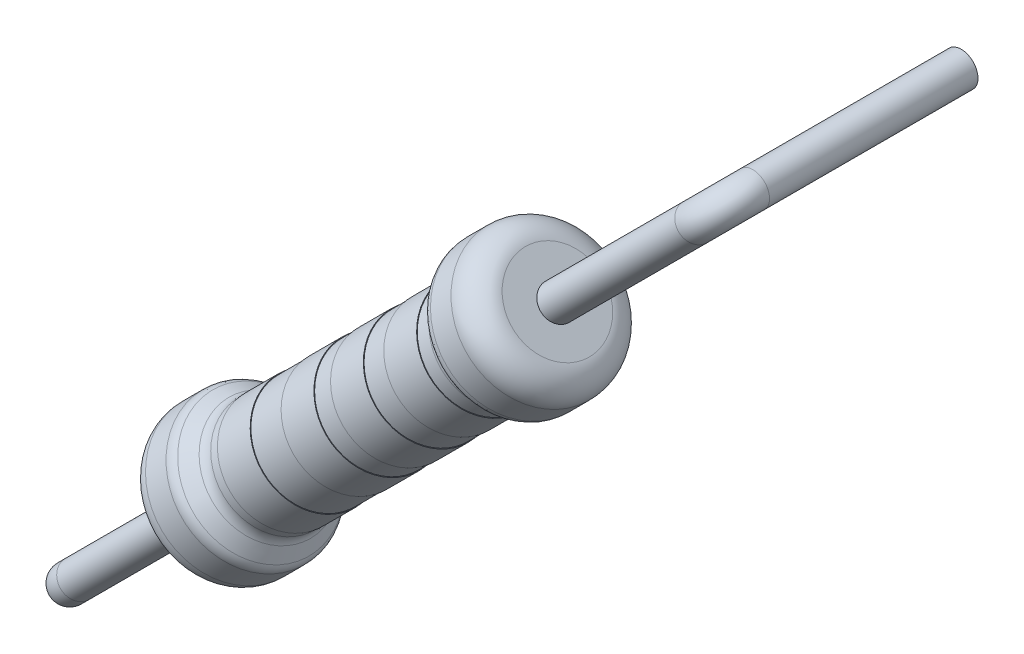
ISO-10303-21;
HEADER;
FILE_DESCRIPTION(('STEP AP214'),'2;1');
FILE_NAME('part.step','',(''),(''),'','','');
FILE_SCHEMA(('AUTOMOTIVE_DESIGN { 1 0 10303 214 1 1 1 1 }'));
ENDSEC;
DATA;
#1=APPLICATION_CONTEXT('core data for automotive mechanical design processes');
#2=APPLICATION_PROTOCOL_DEFINITION('international standard','automotive_design',2000,#1);
#3=PRODUCT_CONTEXT('',#1,'mechanical');
#4=PRODUCT('Part','Part','',(#3));
#5=PRODUCT_RELATED_PRODUCT_CATEGORY('part','',(#4));
#6=PRODUCT_DEFINITION_FORMATION('','',#4);
#7=PRODUCT_DEFINITION_CONTEXT('part definition',#1,'design');
#8=PRODUCT_DEFINITION('design','',#6,#7);
#9=PRODUCT_DEFINITION_SHAPE('','',#8);
#10=(LENGTH_UNIT() NAMED_UNIT(*) SI_UNIT(.MILLI.,.METRE.));
#11=(NAMED_UNIT(*) PLANE_ANGLE_UNIT() SI_UNIT($,.RADIAN.));
#12=(NAMED_UNIT(*) SI_UNIT($,.STERADIAN.) SOLID_ANGLE_UNIT());
#13=UNCERTAINTY_MEASURE_WITH_UNIT(LENGTH_MEASURE(1.E-05),#10,'distance_accuracy_value','');
#14=(GEOMETRIC_REPRESENTATION_CONTEXT(3) GLOBAL_UNCERTAINTY_ASSIGNED_CONTEXT((#13)) GLOBAL_UNIT_ASSIGNED_CONTEXT((#10,
#11,#12)) REPRESENTATION_CONTEXT('',''));
#15=CARTESIAN_POINT('',(0.,0.,0.));
#16=DIRECTION('',(0.,0.,1.));
#17=DIRECTION('',(1.,0.,0.));
#18=AXIS2_PLACEMENT_3D('',#15,#16,#17);
#19=CARTESIAN_POINT('',(9.78091905349187,15.8781031060535,0.7747));
#20=DIRECTION('',(-0.707106781186548,0.707106781186548,0.));
#21=DIRECTION('',(0.,0.,1.));
#22=AXIS2_PLACEMENT_3D('',#19,#20,#21);
#23=TOROIDAL_SURFACE('',#22,0.635,0.3175);
#24=CARTESIAN_POINT('',(9.33190624743841,15.4290903000001,0.7747));
#25=DIRECTION('',(0.,0.,-1.));
#26=DIRECTION('',(-0.707106781186548,-0.707106781186548,0.));
#27=AXIS2_PLACEMENT_3D('',#24,#25,#26);
#28=CIRCLE('',#27,0.3175);
#29=CARTESIAN_POINT('',(9.55641265046514,15.6535967030267,0.7747));
#30=VERTEX_POINT('',#29);
#31=EDGE_CURVE('E40',#30,#30,#28,.T.);
#32=ORIENTED_EDGE('',*,*,#31,.F.);
#33=EDGE_LOOP('',(#32));
#34=FACE_BOUND('',#33,.T.);
#35=CARTESIAN_POINT('',(9.78091905349187,15.8781031060535,1.4097));
#36=DIRECTION('',(-0.707106781186548,-0.707106781186548,0.));
#37=DIRECTION('',(0.,0.,1.));
#38=AXIS2_PLACEMENT_3D('',#35,#36,#37);
#39=CIRCLE('',#38,0.3175);
#40=CARTESIAN_POINT('',(9.78091905349187,15.8781031060535,1.0922));
#41=VERTEX_POINT('',#40);
#42=EDGE_CURVE('E11',#41,#41,#39,.T.);
#43=ORIENTED_EDGE('',*,*,#42,.T.);
#44=EDGE_LOOP('',(#43));
#45=FACE_BOUND('',#44,.T.);
#46=ADVANCED_FACE('F16',(#34,#45),#23,.T.);
#47=CARTESIAN_POINT('',(21.4552520108817,27.5524360634434,0.7747));
#48=DIRECTION('',(0.707106781186548,-0.707106781186548,0.));
#49=DIRECTION('',(0.,0.,-1.));
#50=AXIS2_PLACEMENT_3D('',#47,#48,#49);
#51=TOROIDAL_SURFACE('',#50,0.635,0.3175);
#52=CARTESIAN_POINT('',(21.9042648169352,28.0014488694968,0.7747));
#53=DIRECTION('',(0.,0.,-1.));
#54=DIRECTION('',(-0.707106781186548,-0.707106781186548,0.));
#55=AXIS2_PLACEMENT_3D('',#52,#53,#54);
#56=CIRCLE('',#55,0.3175);
#57=CARTESIAN_POINT('',(21.6797584139085,27.7769424664701,0.7747));
#58=VERTEX_POINT('',#57);
#59=EDGE_CURVE('E121',#58,#58,#56,.T.);
#60=ORIENTED_EDGE('',*,*,#59,.F.);
#61=EDGE_LOOP('',(#60));
#62=FACE_BOUND('',#61,.T.);
#63=CARTESIAN_POINT('',(21.4552520108817,27.5524360634434,1.4097));
#64=DIRECTION('',(0.707106781186548,0.707106781186548,0.));
#65=DIRECTION('',(0.,0.,-1.));
#66=AXIS2_PLACEMENT_3D('',#63,#64,#65);
#67=CIRCLE('',#66,0.3175);
#68=CARTESIAN_POINT('',(21.4552520108817,27.5524360634434,1.0922));
#69=VERTEX_POINT('',#68);
#70=EDGE_CURVE('E27',#69,#69,#67,.T.);
#71=ORIENTED_EDGE('',*,*,#70,.T.);
#72=EDGE_LOOP('',(#71));
#73=FACE_BOUND('',#72,.T.);
#74=ADVANCED_FACE('F339',(#62,#73),#51,.T.);
#75=CARTESIAN_POINT('',(21.9042648169352,28.0014488694968,0.0127000000000011));
#76=DIRECTION('',(0.,0.,-1.));
#77=DIRECTION('',(-0.707106781186548,-0.707106781186548,0.));
#78=AXIS2_PLACEMENT_3D('',#75,#76,#77);
#79=CYLINDRICAL_SURFACE('',#78,0.3175);
#80=ORIENTED_EDGE('',*,*,#59,.T.);
#81=EDGE_LOOP('',(#80));
#82=FACE_BOUND('',#81,.T.);
#83=CARTESIAN_POINT('',(21.9042648169352,28.0014488694968,-3.1623));
#84=DIRECTION('',(0.,0.,1.));
#85=DIRECTION('',(-0.707106781186548,-0.707106781186548,0.));
#86=AXIS2_PLACEMENT_3D('',#83,#84,#85);
#87=CIRCLE('',#86,0.3175);
#88=CARTESIAN_POINT('',(21.6797584139085,27.7769424664701,-3.1623));
#89=VERTEX_POINT('',#88);
#90=EDGE_CURVE('E203',#89,#89,#87,.T.);
#91=ORIENTED_EDGE('',*,*,#90,.T.);
#92=EDGE_LOOP('',(#91));
#93=FACE_BOUND('',#92,.T.);
#94=ADVANCED_FACE('F344',(#82,#93),#79,.T.);
#95=CARTESIAN_POINT('',(9.33190624743841,15.4290903000001,0.0127000000000011));
#96=DIRECTION('',(0.,0.,-1.));
#97=DIRECTION('',(-0.707106781186548,-0.707106781186548,0.));
#98=AXIS2_PLACEMENT_3D('',#95,#96,#97);
#99=CYLINDRICAL_SURFACE('',#98,0.3175);
#100=ORIENTED_EDGE('',*,*,#31,.T.);
#101=EDGE_LOOP('',(#100));
#102=FACE_BOUND('',#101,.T.);
#103=CARTESIAN_POINT('',(9.33190624743841,15.4290903000001,-3.1623));
#104=DIRECTION('',(0.,0.,1.));
#105=DIRECTION('',(-0.707106781186548,-0.707106781186548,0.));
#106=AXIS2_PLACEMENT_3D('',#103,#104,#105);
#107=CIRCLE('',#106,0.3175);
#108=CARTESIAN_POINT('',(9.10739984441168,15.2045838969733,-3.1623));
#109=VERTEX_POINT('',#108);
#110=EDGE_CURVE('E204',#109,#109,#107,.T.);
#111=ORIENTED_EDGE('',*,*,#110,.T.);
#112=EDGE_LOOP('',(#111));
#113=FACE_BOUND('',#112,.T.);
#114=ADVANCED_FACE('F460',(#102,#113),#99,.T.);
#115=CARTESIAN_POINT('',(12.7260187971338,18.8232028496954,1.4097));
#116=DIRECTION('',(-0.707106781186548,-0.707106781186548,0.));
#117=DIRECTION('',(0.,0.,1.));
#118=AXIS2_PLACEMENT_3D('',#115,#116,#117);
#119=TOROIDAL_SURFACE('',#118,0.85255,0.5);
#120=CARTESIAN_POINT('',(12.7260187971338,18.8232028496954,1.4097));
#121=DIRECTION('',(-0.707106781186548,-0.707106781186548,0.));
#122=DIRECTION('',(0.,0.,1.));
#123=AXIS2_PLACEMENT_3D('',#120,#121,#122);
#124=CIRCLE('',#123,1.35255);
#125=CARTESIAN_POINT('',(12.7260187971338,18.8232028496954,0.0571500000000012));
#126=VERTEX_POINT('',#125);
#127=EDGE_CURVE('E244',#126,#126,#124,.T.);
#128=ORIENTED_EDGE('',*,*,#127,.T.);
#129=EDGE_LOOP('',(#128));
#130=FACE_BOUND('',#129,.T.);
#131=CARTESIAN_POINT('',(12.3724654065406,18.4696494591022,1.4097));
#132=DIRECTION('',(-0.707106781186548,-0.707106781186548,0.));
#133=DIRECTION('',(0.,0.,1.));
#134=AXIS2_PLACEMENT_3D('',#131,#132,#133);
#135=CIRCLE('',#134,0.85255);
#136=CARTESIAN_POINT('',(12.3724654065406,18.4696494591022,2.26225));
#137=VERTEX_POINT('',#136);
#138=EDGE_CURVE('E197',#137,#137,#135,.T.);
#139=ORIENTED_EDGE('',*,*,#138,.F.);
#140=EDGE_LOOP('',(#139));
#141=FACE_BOUND('',#140,.T.);
#142=ADVANCED_FACE('F416',(#130,#141),#119,.T.);
#143=CARTESIAN_POINT('',(12.9198308926762,19.0170149452379,1.4097));
#144=DIRECTION('',(-0.707106781186548,-0.707106781186548,0.));
#145=DIRECTION('',(0.,0.,1.));
#146=AXIS2_PLACEMENT_3D('',#143,#144,#145);
#147=CYLINDRICAL_SURFACE('',#146,1.35255);
#148=CARTESIAN_POINT('',(13.1136429882179,19.2108270407795,1.4097));
#149=DIRECTION('',(-0.707106781186548,-0.707106781186548,0.));
#150=DIRECTION('',(0.,0.,1.));
#151=AXIS2_PLACEMENT_3D('',#148,#149,#150);
#152=CIRCLE('',#151,1.35255);
#153=CARTESIAN_POINT('',(13.1136429882179,19.2108270407795,0.0571500000000011));
#154=VERTEX_POINT('',#153);
#155=EDGE_CURVE('E248',#154,#154,#152,.T.);
#156=ORIENTED_EDGE('',*,*,#155,.T.);
#157=EDGE_LOOP('',(#156));
#158=FACE_BOUND('',#157,.T.);
#159=ORIENTED_EDGE('',*,*,#127,.F.);
#160=EDGE_LOOP('',(#159));
#161=FACE_BOUND('',#160,.T.);
#162=ADVANCED_FACE('F451',(#158,#161),#147,.T.);
#163=CARTESIAN_POINT('',(13.1136429882179,19.2108270407795,1.4097));
#164=DIRECTION('',(-0.707106781186548,-0.707106781186548,0.));
#165=DIRECTION('',(0.,0.,1.));
#166=AXIS2_PLACEMENT_3D('',#163,#164,#165);
#167=TOROIDAL_SURFACE('',#166,1.05255,0.3);
#168=CARTESIAN_POINT('',(13.2489396536663,19.3461237062279,1.4097));
#169=DIRECTION('',(-0.707106781186548,-0.707106781186548,0.));
#170=DIRECTION('',(0.,0.,1.));
#171=AXIS2_PLACEMENT_3D('',#168,#169,#170);
#172=CIRCLE('',#171,1.283611949782);
#173=CARTESIAN_POINT('',(13.2489396536663,19.3461237062279,0.12608805037443));
#174=VERTEX_POINT('',#173);
#175=EDGE_CURVE('E274',#174,#174,#172,.T.);
#176=ORIENTED_EDGE('',*,*,#175,.T.);
#177=EDGE_LOOP('',(#176));
#178=FACE_BOUND('',#177,.T.);
#179=ORIENTED_EDGE('',*,*,#155,.F.);
#180=EDGE_LOOP('',(#179));
#181=FACE_BOUND('',#180,.T.);
#182=ADVANCED_FACE('F444',(#178,#181),#167,.T.);
#183=CARTESIAN_POINT('',(13.3321206196129,19.4293046721745,1.4097));
#184=DIRECTION('',(-0.707106781186548,-0.707106781186548,0.));
#185=DIRECTION('',(0.,0.,1.));
#186=AXIS2_PLACEMENT_3D('',#183,#184,#185);
#187=CONICAL_SURFACE('',#186,1.1861999152,0.691631466793246);
#188=CARTESIAN_POINT('',(13.4153015855596,19.5124856381212,1.4097));
#189=DIRECTION('',(-0.707106781186548,-0.707106781186548,0.));
#190=DIRECTION('',(0.,0.,1.));
#191=AXIS2_PLACEMENT_3D('',#188,#189,#190);
#192=CIRCLE('',#191,1.088787880619);
#193=CARTESIAN_POINT('',(13.4153015855596,19.5124856381212,0.320912119381024));
#194=VERTEX_POINT('',#193);
#195=EDGE_CURVE('E270',#194,#194,#192,.T.);
#196=ORIENTED_EDGE('',*,*,#195,.T.);
#197=EDGE_LOOP('',(#196));
#198=FACE_BOUND('',#197,.T.);
#199=ORIENTED_EDGE('',*,*,#175,.F.);
#200=EDGE_LOOP('',(#199));
#201=FACE_BOUND('',#200,.T.);
#202=ADVANCED_FACE('F439',(#198,#201),#187,.T.);
#203=CARTESIAN_POINT('',(13.550598251008,19.6477823035696,1.4097));
#204=DIRECTION('',(-0.707106781186548,-0.707106781186548,0.));
#205=DIRECTION('',(0.,0.,1.));
#206=AXIS2_PLACEMENT_3D('',#203,#204,#205);
#207=TOROIDAL_SURFACE('',#206,1.319849830401,0.3);
#208=ORIENTED_EDGE('',*,*,#195,.F.);
#209=EDGE_LOOP('',(#208));
#210=FACE_BOUND('',#209,.T.);
#211=CARTESIAN_POINT('',(13.550598251008,19.6477823035696,1.4097));
#212=DIRECTION('',(-0.707106781186548,-0.707106781186548,0.));
#213=DIRECTION('',(0.,0.,1.));
#214=AXIS2_PLACEMENT_3D('',#211,#212,#213);
#215=CIRCLE('',#214,1.019849830401);
#216=CARTESIAN_POINT('',(13.550598251008,19.6477823035696,2.429549830401));
#217=VERTEX_POINT('',#216);
#218=EDGE_CURVE('E238',#217,#217,#215,.T.);
#219=ORIENTED_EDGE('',*,*,#218,.T.);
#220=EDGE_LOOP('',(#219));
#221=FACE_BOUND('',#220,.T.);
#222=ADVANCED_FACE('F368',(#210,#221),#207,.F.);
#223=CARTESIAN_POINT('',(15.6110144643749,21.7081985169366,1.4097));
#224=DIRECTION('',(-0.707106781186548,-0.707106781186548,0.));
#225=DIRECTION('',(0.,0.,1.));
#226=AXIS2_PLACEMENT_3D('',#223,#224,#225);
#227=CYLINDRICAL_SURFACE('',#226,1.019849830401);
#228=CARTESIAN_POINT('',(13.689491458397,19.7866755109586,1.4097));
#229=DIRECTION('',(-0.707106781186548,-0.707106781186548,0.));
#230=DIRECTION('',(0.,0.,1.));
#231=AXIS2_PLACEMENT_3D('',#228,#229,#230);
#232=CIRCLE('',#231,1.019849830401);
#233=CARTESIAN_POINT('',(13.689491458397,19.7866755109586,0.389850169599001));
#234=VERTEX_POINT('',#233);
#235=EDGE_CURVE('E234',#234,#234,#232,.T.);
#236=ORIENTED_EDGE('',*,*,#235,.T.);
#237=EDGE_LOOP('',(#236));
#238=FACE_BOUND('',#237,.T.);
#239=ORIENTED_EDGE('',*,*,#218,.F.);
#240=EDGE_LOOP('',(#239));
#241=FACE_BOUND('',#240,.T.);
#242=ADVANCED_FACE('F360',(#238,#241),#227,.T.);
#243=CARTESIAN_POINT('',(17.6714306777419,23.7686147303036,1.4097));
#244=DIRECTION('',(-0.707106781186548,-0.707106781186548,0.));
#245=DIRECTION('',(0.,0.,1.));
#246=AXIS2_PLACEMENT_3D('',#243,#244,#245);
#247=TOROIDAL_SURFACE('',#246,1.319849830401,0.3);
#248=CARTESIAN_POINT('',(17.6714306777419,23.7686147303036,1.4097));
#249=DIRECTION('',(-0.707106781186548,-0.707106781186548,0.));
#250=DIRECTION('',(0.,0.,1.));
#251=AXIS2_PLACEMENT_3D('',#248,#249,#250);
#252=CIRCLE('',#251,1.019849830401);
#253=CARTESIAN_POINT('',(17.6714306777419,23.7686147303036,2.429549830401));
#254=VERTEX_POINT('',#253);
#255=EDGE_CURVE('E206',#254,#254,#252,.T.);
#256=ORIENTED_EDGE('',*,*,#255,.F.);
#257=EDGE_LOOP('',(#256));
#258=FACE_BOUND('',#257,.T.);
#259=CARTESIAN_POINT('',(17.8067273431903,23.903911395752,1.4097));
#260=DIRECTION('',(-0.707106781186548,-0.707106781186548,0.));
#261=DIRECTION('',(0.,0.,1.));
#262=AXIS2_PLACEMENT_3D('',#259,#260,#261);
#263=CIRCLE('',#262,1.088787880619);
#264=CARTESIAN_POINT('',(17.8067273431903,23.903911395752,2.498487880619));
#265=VERTEX_POINT('',#264);
#266=EDGE_CURVE('E239',#265,#265,#263,.T.);
#267=ORIENTED_EDGE('',*,*,#266,.T.);
#268=EDGE_LOOP('',(#267));
#269=FACE_BOUND('',#268,.T.);
#270=ADVANCED_FACE('F358',(#258,#269),#247,.F.);
#271=CARTESIAN_POINT('',(17.889908309137,23.9870923616986,1.4097));
#272=DIRECTION('',(0.707106781186548,0.707106781186548,0.));
#273=DIRECTION('',(0.,0.,1.));
#274=AXIS2_PLACEMENT_3D('',#271,#272,#273);
#275=CONICAL_SURFACE('',#274,1.1861999152,0.691631466793246);
#276=ORIENTED_EDGE('',*,*,#266,.F.);
#277=EDGE_LOOP('',(#276));
#278=FACE_BOUND('',#277,.T.);
#279=CARTESIAN_POINT('',(17.9730892750836,24.0702733276452,1.4097));
#280=DIRECTION('',(-0.707106781186548,-0.707106781186548,0.));
#281=DIRECTION('',(0.,0.,1.));
#282=AXIS2_PLACEMENT_3D('',#279,#280,#281);
#283=CIRCLE('',#282,1.283611949782);
#284=CARTESIAN_POINT('',(17.9730892750836,24.0702733276452,2.693311949782));
#285=VERTEX_POINT('',#284);
#286=EDGE_CURVE('E259',#285,#285,#283,.T.);
#287=ORIENTED_EDGE('',*,*,#286,.T.);
#288=EDGE_LOOP('',(#287));
#289=FACE_BOUND('',#288,.T.);
#290=ADVANCED_FACE('F354',(#278,#289),#275,.T.);
#291=CARTESIAN_POINT('',(18.108385940532,24.2055699930936,1.4097));
#292=DIRECTION('',(-0.707106781186548,-0.707106781186548,0.));
#293=DIRECTION('',(0.,0.,1.));
#294=AXIS2_PLACEMENT_3D('',#291,#292,#293);
#295=TOROIDAL_SURFACE('',#294,1.05255,0.3);
#296=CARTESIAN_POINT('',(18.108385940532,24.2055699930936,1.4097));
#297=DIRECTION('',(-0.707106781186548,-0.707106781186548,0.));
#298=DIRECTION('',(0.,0.,1.));
#299=AXIS2_PLACEMENT_3D('',#296,#297,#298);
#300=CIRCLE('',#299,1.35255);
#301=CARTESIAN_POINT('',(18.108385940532,24.2055699930936,0.0571500000000012));
#302=VERTEX_POINT('',#301);
#303=EDGE_CURVE('E255',#302,#302,#300,.T.);
#304=ORIENTED_EDGE('',*,*,#303,.T.);
#305=EDGE_LOOP('',(#304));
#306=FACE_BOUND('',#305,.T.);
#307=ORIENTED_EDGE('',*,*,#286,.F.);
#308=EDGE_LOOP('',(#307));
#309=FACE_BOUND('',#308,.T.);
#310=ADVANCED_FACE('F350',(#306,#309),#295,.T.);
#311=CARTESIAN_POINT('',(18.3021980360737,24.3993820886353,1.4097));
#312=DIRECTION('',(-0.707106781186548,-0.707106781186548,0.));
#313=DIRECTION('',(0.,0.,1.));
#314=AXIS2_PLACEMENT_3D('',#311,#312,#313);
#315=CYLINDRICAL_SURFACE('',#314,1.35255);
#316=CARTESIAN_POINT('',(18.4960101316161,24.5931941841777,1.4097));
#317=DIRECTION('',(-0.707106781186548,-0.707106781186548,0.));
#318=DIRECTION('',(0.,0.,1.));
#319=AXIS2_PLACEMENT_3D('',#316,#317,#318);
#320=CIRCLE('',#319,1.35255);
#321=CARTESIAN_POINT('',(18.4960101316161,24.5931941841777,0.0571500000000011));
#322=VERTEX_POINT('',#321);
#323=EDGE_CURVE('E260',#322,#322,#320,.T.);
#324=ORIENTED_EDGE('',*,*,#323,.T.);
#325=EDGE_LOOP('',(#324));
#326=FACE_BOUND('',#325,.T.);
#327=ORIENTED_EDGE('',*,*,#303,.F.);
#328=EDGE_LOOP('',(#327));
#329=FACE_BOUND('',#328,.T.);
#330=ADVANCED_FACE('F353',(#326,#329),#315,.T.);
#331=CARTESIAN_POINT('',(18.4960101316161,24.5931941841777,1.4097));
#332=DIRECTION('',(-0.707106781186548,-0.707106781186548,0.));
#333=DIRECTION('',(0.,0.,1.));
#334=AXIS2_PLACEMENT_3D('',#331,#332,#333);
#335=TOROIDAL_SURFACE('',#334,0.85255,0.5);
#336=CARTESIAN_POINT('',(18.8495635222094,24.946747574771,1.4097));
#337=DIRECTION('',(-0.707106781186548,-0.707106781186548,0.));
#338=DIRECTION('',(0.,0.,1.));
#339=AXIS2_PLACEMENT_3D('',#336,#337,#338);
#340=CIRCLE('',#339,0.85255);
#341=CARTESIAN_POINT('',(18.8495635222094,24.946747574771,0.55715));
#342=VERTEX_POINT('',#341);
#343=EDGE_CURVE('E20',#342,#342,#340,.T.);
#344=ORIENTED_EDGE('',*,*,#343,.T.);
#345=EDGE_LOOP('',(#344));
#346=FACE_BOUND('',#345,.T.);
#347=ORIENTED_EDGE('',*,*,#323,.F.);
#348=EDGE_LOOP('',(#347));
#349=FACE_BOUND('',#348,.T.);
#350=ADVANCED_FACE('F18',(#346,#349),#335,.T.);
#351=CARTESIAN_POINT('',(9.78091905349187,15.8781031060535,1.4097));
#352=DIRECTION('',(0.707106781186548,0.707106781186548,0.));
#353=DIRECTION('',(0.,0.,1.));
#354=AXIS2_PLACEMENT_3D('',#351,#352,#353);
#355=CYLINDRICAL_SURFACE('',#354,0.3175);
#356=ORIENTED_EDGE('',*,*,#42,.F.);
#357=EDGE_LOOP('',(#356));
#358=FACE_BOUND('',#357,.T.);
#359=CARTESIAN_POINT('',(12.3724654065406,18.4696494591022,1.4097));
#360=DIRECTION('',(0.707106781186548,0.707106781186548,0.));
#361=DIRECTION('',(0.,0.,1.));
#362=AXIS2_PLACEMENT_3D('',#359,#360,#361);
#363=CIRCLE('',#362,0.3175);
#364=CARTESIAN_POINT('',(12.3724654065406,18.4696494591022,1.7272));
#365=VERTEX_POINT('',#364);
#366=EDGE_CURVE('E189',#365,#365,#363,.T.);
#367=ORIENTED_EDGE('',*,*,#366,.F.);
#368=EDGE_LOOP('',(#367));
#369=FACE_BOUND('',#368,.T.);
#370=ADVANCED_FACE('F697',(#358,#369),#355,.T.);
#371=CARTESIAN_POINT('',(21.4552520108817,27.5524360634434,1.4097));
#372=DIRECTION('',(-0.707106781186548,-0.707106781186548,0.));
#373=DIRECTION('',(0.,0.,-1.));
#374=AXIS2_PLACEMENT_3D('',#371,#372,#373);
#375=CYLINDRICAL_SURFACE('',#374,0.3175);
#376=ORIENTED_EDGE('',*,*,#70,.F.);
#377=EDGE_LOOP('',(#376));
#378=FACE_BOUND('',#377,.T.);
#379=CARTESIAN_POINT('',(18.8495635222094,24.946747574771,1.4097));
#380=DIRECTION('',(-0.707106781186548,-0.707106781186548,0.));
#381=DIRECTION('',(0.,0.,-1.));
#382=AXIS2_PLACEMENT_3D('',#379,#380,#381);
#383=CIRCLE('',#382,0.3175);
#384=CARTESIAN_POINT('',(18.8495635222094,24.946747574771,1.0922));
#385=VERTEX_POINT('',#384);
#386=EDGE_CURVE('E185',#385,#385,#383,.T.);
#387=ORIENTED_EDGE('',*,*,#386,.F.);
#388=EDGE_LOOP('',(#387));
#389=FACE_BOUND('',#388,.T.);
#390=ADVANCED_FACE('F186',(#378,#389),#375,.T.);
#391=CARTESIAN_POINT('',(15.6110144643749,21.7081985169366,1.4097));
#392=DIRECTION('',(-0.707106781186548,-0.707106781186548,0.));
#393=DIRECTION('',(0.,0.,1.));
#394=AXIS2_PLACEMENT_3D('',#391,#392,#393);
#395=CYLINDRICAL_SURFACE('',#394,1.019849830401);
#396=ORIENTED_EDGE('',*,*,#255,.T.);
#397=EDGE_LOOP('',(#396));
#398=FACE_BOUND('',#397,.T.);
#399=CARTESIAN_POINT('',(17.452218773125,23.5494028256866,1.4097));
#400=DIRECTION('',(0.707106781186548,0.707106781186548,0.));
#401=DIRECTION('',(0.,0.,1.));
#402=AXIS2_PLACEMENT_3D('',#399,#400,#401);
#403=CIRCLE('',#402,1.019849830401);
#404=CARTESIAN_POINT('',(17.452218773125,23.5494028256866,2.429549830401));
#405=VERTEX_POINT('',#404);
#406=EDGE_CURVE('E210',#405,#405,#403,.T.);
#407=ORIENTED_EDGE('',*,*,#406,.T.);
#408=EDGE_LOOP('',(#407));
#409=FACE_BOUND('',#408,.T.);
#410=ADVANCED_FACE('F375',(#398,#409),#395,.T.);
#411=CARTESIAN_POINT('',(15.6110144643749,21.7081985169366,1.4097));
#412=DIRECTION('',(-0.707106781186548,-0.707106781186548,0.));
#413=DIRECTION('',(0.,0.,1.));
#414=AXIS2_PLACEMENT_3D('',#411,#412,#413);
#415=CYLINDRICAL_SURFACE('',#414,1.019849830401);
#416=CARTESIAN_POINT('',(16.8325811007712,22.9297651533328,1.4097));
#417=DIRECTION('',(-0.707106781186548,-0.707106781186548,0.));
#418=DIRECTION('',(0.,0.,1.));
#419=AXIS2_PLACEMENT_3D('',#416,#417,#418);
#420=CIRCLE('',#419,1.019849830401);
#421=CARTESIAN_POINT('',(16.8325811007712,22.9297651533328,0.389850169599001));
#422=VERTEX_POINT('',#421);
#423=EDGE_CURVE('E225',#422,#422,#420,.T.);
#424=ORIENTED_EDGE('',*,*,#423,.T.);
#425=EDGE_LOOP('',(#424));
#426=FACE_BOUND('',#425,.T.);
#427=CARTESIAN_POINT('',(16.4464300875652,22.5436141401268,1.4097));
#428=DIRECTION('',(0.707106781186548,0.707106781186548,0.));
#429=DIRECTION('',(0.,0.,1.));
#430=AXIS2_PLACEMENT_3D('',#427,#428,#429);
#431=CIRCLE('',#430,1.019849830401);
#432=CARTESIAN_POINT('',(16.4464300875652,22.5436141401268,2.429549830401));
#433=VERTEX_POINT('',#432);
#434=EDGE_CURVE('E229',#433,#433,#431,.T.);
#435=ORIENTED_EDGE('',*,*,#434,.T.);
#436=EDGE_LOOP('',(#435));
#437=FACE_BOUND('',#436,.T.);
#438=ADVANCED_FACE('F378',(#426,#437),#415,.T.);
#439=CARTESIAN_POINT('',(15.6110144643749,21.7081985169366,1.4097));
#440=DIRECTION('',(-0.707106781186548,-0.707106781186548,0.));
#441=DIRECTION('',(0.,0.,1.));
#442=AXIS2_PLACEMENT_3D('',#439,#440,#441);
#443=CYLINDRICAL_SURFACE('',#442,1.019849830401);
#444=CARTESIAN_POINT('',(15.8267924152114,21.9239764677731,1.4097));
#445=DIRECTION('',(-0.707106781186548,-0.707106781186548,0.));
#446=DIRECTION('',(0.,0.,1.));
#447=AXIS2_PLACEMENT_3D('',#444,#445,#446);
#448=CIRCLE('',#447,1.019849830401);
#449=CARTESIAN_POINT('',(15.8267924152114,21.9239764677731,0.389850169599001));
#450=VERTEX_POINT('',#449);
#451=EDGE_CURVE('E217',#450,#450,#448,.T.);
#452=ORIENTED_EDGE('',*,*,#451,.T.);
#453=EDGE_LOOP('',(#452));
#454=FACE_BOUND('',#453,.T.);
#455=CARTESIAN_POINT('',(15.512483450974,21.6096675035356,1.4097));
#456=DIRECTION('',(0.707106781186548,0.707106781186548,0.));
#457=DIRECTION('',(0.,0.,1.));
#458=AXIS2_PLACEMENT_3D('',#455,#456,#457);
#459=CIRCLE('',#458,1.019849830401);
#460=CARTESIAN_POINT('',(15.512483450974,21.6096675035356,2.429549830401));
#461=VERTEX_POINT('',#460);
#462=EDGE_CURVE('E213',#461,#461,#459,.T.);
#463=ORIENTED_EDGE('',*,*,#462,.T.);
#464=EDGE_LOOP('',(#463));
#465=FACE_BOUND('',#464,.T.);
#466=ADVANCED_FACE('F394',(#454,#465),#443,.T.);
#467=CARTESIAN_POINT('',(15.6110144643749,21.7081985169366,1.4097));
#468=DIRECTION('',(-0.707106781186548,-0.707106781186548,0.));
#469=DIRECTION('',(0.,0.,1.));
#470=AXIS2_PLACEMENT_3D('',#467,#468,#469);
#471=CYLINDRICAL_SURFACE('',#470,1.019849830401);
#472=CARTESIAN_POINT('',(14.8928457786202,20.9900298311819,1.4097));
#473=DIRECTION('',(-0.707106781186548,-0.707106781186548,0.));
#474=DIRECTION('',(0.,0.,1.));
#475=AXIS2_PLACEMENT_3D('',#472,#473,#474);
#476=CIRCLE('',#475,1.019849830401);
#477=CARTESIAN_POINT('',(14.8928457786202,20.9900298311819,0.389850169599001));
#478=VERTEX_POINT('',#477);
#479=EDGE_CURVE('E218',#478,#478,#476,.T.);
#480=ORIENTED_EDGE('',*,*,#479,.T.);
#481=EDGE_LOOP('',(#480));
#482=FACE_BOUND('',#481,.T.);
#483=CARTESIAN_POINT('',(14.3091291307507,20.4063131833123,1.4097));
#484=DIRECTION('',(0.707106781186548,0.707106781186548,0.));
#485=DIRECTION('',(0.,0.,1.));
#486=AXIS2_PLACEMENT_3D('',#483,#484,#485);
#487=CIRCLE('',#486,1.019849830401);
#488=CARTESIAN_POINT('',(14.3091291307507,20.4063131833123,2.429549830401));
#489=VERTEX_POINT('',#488);
#490=EDGE_CURVE('E233',#489,#489,#487,.T.);
#491=ORIENTED_EDGE('',*,*,#490,.T.);
#492=EDGE_LOOP('',(#491));
#493=FACE_BOUND('',#492,.T.);
#494=ADVANCED_FACE('F399',(#482,#493),#471,.T.);
#495=CARTESIAN_POINT('',(13.9993102945738,20.0964943471354,1.4097));
#496=DIRECTION('',(-0.707106781186548,-0.707106781186548,0.));
#497=DIRECTION('',(0.,0.,1.));
#498=AXIS2_PLACEMENT_3D('',#495,#496,#497);
#499=CYLINDRICAL_SURFACE('',#498,1.030517137019);
#500=CARTESIAN_POINT('',(14.3091291307507,20.4063131833123,1.4097));
#501=DIRECTION('',(-0.707106781186548,-0.707106781186548,0.));
#502=DIRECTION('',(0.,0.,1.));
#503=AXIS2_PLACEMENT_3D('',#500,#501,#502);
#504=CIRCLE('',#503,1.030517137019);
#505=CARTESIAN_POINT('',(14.3091291307507,20.4063131833123,0.379182862981001));
#506=VERTEX_POINT('',#505);
#507=EDGE_CURVE('E243',#506,#506,#504,.T.);
#508=ORIENTED_EDGE('',*,*,#507,.T.);
#509=EDGE_LOOP('',(#508));
#510=FACE_BOUND('',#509,.T.);
#511=CARTESIAN_POINT('',(13.689491458397,19.7866755109586,1.4097));
#512=DIRECTION('',(-0.707106781186548,-0.707106781186548,0.));
#513=DIRECTION('',(0.,0.,1.));
#514=AXIS2_PLACEMENT_3D('',#511,#512,#513);
#515=CIRCLE('',#514,1.030517137019);
#516=CARTESIAN_POINT('',(13.689491458397,19.7866755109586,2.440217137019));
#517=VERTEX_POINT('',#516);
#518=EDGE_CURVE('E254',#517,#517,#515,.T.);
#519=ORIENTED_EDGE('',*,*,#518,.F.);
#520=EDGE_LOOP('',(#519));
#521=FACE_BOUND('',#520,.T.);
#522=ADVANCED_FACE('F334',(#510,#521),#499,.T.);
#523=CARTESIAN_POINT('',(15.2026646147971,21.2998486673587,1.4097));
#524=DIRECTION('',(-0.707106781186548,-0.707106781186548,0.));
#525=DIRECTION('',(0.,0.,1.));
#526=AXIS2_PLACEMENT_3D('',#523,#524,#525);
#527=CYLINDRICAL_SURFACE('',#526,1.030517137019);
#528=CARTESIAN_POINT('',(15.512483450974,21.6096675035356,1.4097));
#529=DIRECTION('',(-0.707106781186548,-0.707106781186548,0.));
#530=DIRECTION('',(0.,0.,1.));
#531=AXIS2_PLACEMENT_3D('',#528,#529,#530);
#532=CIRCLE('',#531,1.030517137019);
#533=CARTESIAN_POINT('',(15.512483450974,21.6096675035356,0.379182862981001));
#534=VERTEX_POINT('',#533);
#535=EDGE_CURVE('E281',#534,#534,#532,.T.);
#536=ORIENTED_EDGE('',*,*,#535,.T.);
#537=EDGE_LOOP('',(#536));
#538=FACE_BOUND('',#537,.T.);
#539=CARTESIAN_POINT('',(14.8928457786202,20.9900298311819,1.4097));
#540=DIRECTION('',(-0.707106781186548,-0.707106781186548,0.));
#541=DIRECTION('',(0.,0.,1.));
#542=AXIS2_PLACEMENT_3D('',#539,#540,#541);
#543=CIRCLE('',#542,1.030517137019);
#544=CARTESIAN_POINT('',(14.8928457786202,20.9900298311819,2.440217137019));
#545=VERTEX_POINT('',#544);
#546=EDGE_CURVE('E249',#545,#545,#543,.T.);
#547=ORIENTED_EDGE('',*,*,#546,.F.);
#548=EDGE_LOOP('',(#547));
#549=FACE_BOUND('',#548,.T.);
#550=ADVANCED_FACE('F324',(#538,#549),#527,.T.);
#551=CARTESIAN_POINT('',(16.1366112513883,22.2337953039499,1.4097));
#552=DIRECTION('',(-0.707106781186548,-0.707106781186548,0.));
#553=DIRECTION('',(0.,0.,1.));
#554=AXIS2_PLACEMENT_3D('',#551,#552,#553);
#555=CYLINDRICAL_SURFACE('',#554,1.030517137019);
#556=CARTESIAN_POINT('',(16.4464300875652,22.5436141401268,1.4097));
#557=DIRECTION('',(-0.707106781186548,-0.707106781186548,0.));
#558=DIRECTION('',(0.,0.,1.));
#559=AXIS2_PLACEMENT_3D('',#556,#557,#558);
#560=CIRCLE('',#559,1.030517137019);
#561=CARTESIAN_POINT('',(16.4464300875652,22.5436141401268,0.379182862981001));
#562=VERTEX_POINT('',#561);
#563=EDGE_CURVE('E223',#562,#562,#560,.T.);
#564=ORIENTED_EDGE('',*,*,#563,.T.);
#565=EDGE_LOOP('',(#564));
#566=FACE_BOUND('',#565,.T.);
#567=CARTESIAN_POINT('',(15.8267924152114,21.9239764677731,1.4097));
#568=DIRECTION('',(-0.707106781186548,-0.707106781186548,0.));
#569=DIRECTION('',(0.,0.,1.));
#570=AXIS2_PLACEMENT_3D('',#567,#568,#569);
#571=CIRCLE('',#570,1.030517137019);
#572=CARTESIAN_POINT('',(15.8267924152114,21.9239764677731,2.440217137019));
#573=VERTEX_POINT('',#572);
#574=EDGE_CURVE('E253',#573,#573,#571,.T.);
#575=ORIENTED_EDGE('',*,*,#574,.F.);
#576=EDGE_LOOP('',(#575));
#577=FACE_BOUND('',#576,.T.);
#578=ADVANCED_FACE('F321',(#566,#577),#555,.T.);
#579=CARTESIAN_POINT('',(17.142399936948,23.2395839895096,1.4097));
#580=DIRECTION('',(-0.707106781186548,-0.707106781186548,0.));
#581=DIRECTION('',(0.,0.,1.));
#582=AXIS2_PLACEMENT_3D('',#579,#580,#581);
#583=CYLINDRICAL_SURFACE('',#582,1.030517137019);
#584=CARTESIAN_POINT('',(17.452218773125,23.5494028256866,1.4097));
#585=DIRECTION('',(-0.707106781186548,-0.707106781186548,0.));
#586=DIRECTION('',(0.,0.,1.));
#587=AXIS2_PLACEMENT_3D('',#584,#585,#586);
#588=CIRCLE('',#587,1.030517137019);
#589=CARTESIAN_POINT('',(17.452218773125,23.5494028256866,0.379182862981001));
#590=VERTEX_POINT('',#589);
#591=EDGE_CURVE('E219',#590,#590,#588,.T.);
#592=ORIENTED_EDGE('',*,*,#591,.T.);
#593=EDGE_LOOP('',(#592));
#594=FACE_BOUND('',#593,.T.);
#595=CARTESIAN_POINT('',(16.8325811007712,22.9297651533328,1.4097));
#596=DIRECTION('',(-0.707106781186548,-0.707106781186548,0.));
#597=DIRECTION('',(0.,0.,1.));
#598=AXIS2_PLACEMENT_3D('',#595,#596,#597);
#599=CIRCLE('',#598,1.030517137019);
#600=CARTESIAN_POINT('',(16.8325811007712,22.9297651533328,2.440217137019));
#601=VERTEX_POINT('',#600);
#602=EDGE_CURVE('E224',#601,#601,#599,.T.);
#603=ORIENTED_EDGE('',*,*,#602,.F.);
#604=EDGE_LOOP('',(#603));
#605=FACE_BOUND('',#604,.T.);
#606=ADVANCED_FACE('F323',(#594,#605),#583,.T.);
#607=CARTESIAN_POINT('',(16.8325811007712,22.9297651533328,2.362978321714));
#608=DIRECTION('',(-0.707106781186548,-0.707106781186548,0.));
#609=DIRECTION('',(0.,0.,1.));
#610=AXIS2_PLACEMENT_3D('',#607,#608,#609);
#611=PLANE('',#610);
#612=ORIENTED_EDGE('',*,*,#602,.T.);
#613=EDGE_LOOP('',(#612));
#614=FACE_BOUND('',#613,.T.);
#615=ORIENTED_EDGE('',*,*,#423,.F.);
#616=EDGE_LOOP('',(#615));
#617=FACE_BOUND('',#616,.T.);
#618=ADVANCED_FACE('F331',(#614,#617),#611,.T.);
#619=CARTESIAN_POINT('',(17.452218773125,23.5494028256866,2.362978321714));
#620=DIRECTION('',(0.707106781186548,0.707106781186548,0.));
#621=DIRECTION('',(-0.707106781186548,0.707106781186548,0.));
#622=AXIS2_PLACEMENT_3D('',#619,#620,#621);
#623=PLANE('',#622);
#624=ORIENTED_EDGE('',*,*,#591,.F.);
#625=EDGE_LOOP('',(#624));
#626=FACE_BOUND('',#625,.T.);
#627=ORIENTED_EDGE('',*,*,#406,.F.);
#628=EDGE_LOOP('',(#627));
#629=FACE_BOUND('',#628,.T.);
#630=ADVANCED_FACE('F381',(#626,#629),#623,.T.);
#631=CARTESIAN_POINT('',(15.8267924152114,21.9239764677731,2.362978321714));
#632=DIRECTION('',(-0.707106781186548,-0.707106781186548,0.));
#633=DIRECTION('',(0.,0.,1.));
#634=AXIS2_PLACEMENT_3D('',#631,#632,#633);
#635=PLANE('',#634);
#636=ORIENTED_EDGE('',*,*,#574,.T.);
#637=EDGE_LOOP('',(#636));
#638=FACE_BOUND('',#637,.T.);
#639=ORIENTED_EDGE('',*,*,#451,.F.);
#640=EDGE_LOOP('',(#639));
#641=FACE_BOUND('',#640,.T.);
#642=ADVANCED_FACE('F318',(#638,#641),#635,.T.);
#643=CARTESIAN_POINT('',(16.4464300875652,22.5436141401268,2.362978321714));
#644=DIRECTION('',(0.707106781186548,0.707106781186548,0.));
#645=DIRECTION('',(-0.707106781186548,0.707106781186548,0.));
#646=AXIS2_PLACEMENT_3D('',#643,#644,#645);
#647=PLANE('',#646);
#648=ORIENTED_EDGE('',*,*,#563,.F.);
#649=EDGE_LOOP('',(#648));
#650=FACE_BOUND('',#649,.T.);
#651=ORIENTED_EDGE('',*,*,#434,.F.);
#652=EDGE_LOOP('',(#651));
#653=FACE_BOUND('',#652,.T.);
#654=ADVANCED_FACE('F389',(#650,#653),#647,.T.);
#655=CARTESIAN_POINT('',(14.8928457786202,20.9900298311819,2.362978321714));
#656=DIRECTION('',(-0.707106781186548,-0.707106781186548,0.));
#657=DIRECTION('',(0.,0.,1.));
#658=AXIS2_PLACEMENT_3D('',#655,#656,#657);
#659=PLANE('',#658);
#660=ORIENTED_EDGE('',*,*,#546,.T.);
#661=EDGE_LOOP('',(#660));
#662=FACE_BOUND('',#661,.T.);
#663=ORIENTED_EDGE('',*,*,#479,.F.);
#664=EDGE_LOOP('',(#663));
#665=FACE_BOUND('',#664,.T.);
#666=ADVANCED_FACE('F405',(#662,#665),#659,.T.);
#667=CARTESIAN_POINT('',(15.512483450974,21.6096675035356,2.362978321714));
#668=DIRECTION('',(0.707106781186548,0.707106781186548,0.));
#669=DIRECTION('',(-0.707106781186548,0.707106781186548,0.));
#670=AXIS2_PLACEMENT_3D('',#667,#668,#669);
#671=PLANE('',#670);
#672=ORIENTED_EDGE('',*,*,#535,.F.);
#673=EDGE_LOOP('',(#672));
#674=FACE_BOUND('',#673,.T.);
#675=ORIENTED_EDGE('',*,*,#462,.F.);
#676=EDGE_LOOP('',(#675));
#677=FACE_BOUND('',#676,.T.);
#678=ADVANCED_FACE('F411',(#674,#677),#671,.T.);
#679=CARTESIAN_POINT('',(13.689491458397,19.7866755109586,2.362978321714));
#680=DIRECTION('',(-0.707106781186548,-0.707106781186548,0.));
#681=DIRECTION('',(0.,0.,1.));
#682=AXIS2_PLACEMENT_3D('',#679,#680,#681);
#683=PLANE('',#682);
#684=ORIENTED_EDGE('',*,*,#518,.T.);
#685=EDGE_LOOP('',(#684));
#686=FACE_BOUND('',#685,.T.);
#687=ORIENTED_EDGE('',*,*,#235,.F.);
#688=EDGE_LOOP('',(#687));
#689=FACE_BOUND('',#688,.T.);
#690=ADVANCED_FACE('F421',(#686,#689),#683,.T.);
#691=CARTESIAN_POINT('',(14.3091291307507,20.4063131833123,2.362978321714));
#692=DIRECTION('',(0.707106781186548,0.707106781186548,0.));
#693=DIRECTION('',(-0.707106781186548,0.707106781186548,0.));
#694=AXIS2_PLACEMENT_3D('',#691,#692,#693);
#695=PLANE('',#694);
#696=ORIENTED_EDGE('',*,*,#507,.F.);
#697=EDGE_LOOP('',(#696));
#698=FACE_BOUND('',#697,.T.);
#699=ORIENTED_EDGE('',*,*,#490,.F.);
#700=EDGE_LOOP('',(#699));
#701=FACE_BOUND('',#700,.T.);
#702=ADVANCED_FACE('F423',(#698,#701),#695,.T.);
#703=CARTESIAN_POINT('',(12.3724654065406,18.4696494591022,1.835975));
#704=DIRECTION('',(-0.707106781186548,-0.707106781186548,0.));
#705=DIRECTION('',(0.,0.,1.));
#706=AXIS2_PLACEMENT_3D('',#703,#704,#705);
#707=PLANE('',#706);
#708=ORIENTED_EDGE('',*,*,#138,.T.);
#709=EDGE_LOOP('',(#708));
#710=FACE_BOUND('',#709,.T.);
#711=ORIENTED_EDGE('',*,*,#366,.T.);
#712=EDGE_LOOP('',(#711));
#713=FACE_BOUND('',#712,.T.);
#714=ADVANCED_FACE('F429',(#710,#713),#707,.T.);
#715=CARTESIAN_POINT('',(18.8495635222094,24.946747574771,1.835975));
#716=DIRECTION('',(0.707106781186548,0.707106781186548,0.));
#717=DIRECTION('',(-0.707106781186548,0.707106781186548,0.));
#718=AXIS2_PLACEMENT_3D('',#715,#716,#717);
#719=PLANE('',#718);
#720=ORIENTED_EDGE('',*,*,#343,.F.);
#721=EDGE_LOOP('',(#720));
#722=FACE_BOUND('',#721,.T.);
#723=ORIENTED_EDGE('',*,*,#386,.T.);
#724=EDGE_LOOP('',(#723));
#725=FACE_BOUND('',#724,.T.);
#726=ADVANCED_FACE('F675',(#722,#725),#719,.T.);
#727=CARTESIAN_POINT('',(9.33190624743841,15.4290903000001,-3.1623));
#728=DIRECTION('',(0.,0.,-1.));
#729=DIRECTION('',(0.707106781186548,-0.707106781186548,0.));
#730=AXIS2_PLACEMENT_3D('',#727,#728,#729);
#731=PLANE('',#730);
#732=ORIENTED_EDGE('',*,*,#110,.F.);
#733=EDGE_LOOP('',(#732));
#734=FACE_BOUND('',#733,.T.);
#735=ADVANCED_FACE('F419',(#734),#731,.T.);
#736=CARTESIAN_POINT('',(21.9042648169352,28.0014488694968,-3.1623));
#737=DIRECTION('',(0.,0.,-1.));
#738=DIRECTION('',(0.707106781186548,-0.707106781186548,0.));
#739=AXIS2_PLACEMENT_3D('',#736,#737,#738);
#740=PLANE('',#739);
#741=ORIENTED_EDGE('',*,*,#90,.F.);
#742=EDGE_LOOP('',(#741));
#743=FACE_BOUND('',#742,.T.);
#744=ADVANCED_FACE('F417',(#743),#740,.T.);
#745=CLOSED_SHELL('',(#46,#74,#94,#114,#142,#162,#182,#202,#222,#242,#270,#290,#310,#330,#350,
#370,#390,#410,#438,#466,#494,#522,#550,#578,#606,#618,#630,#642,#654,#666,#678,#690,#702,#714,
#726,#735,#744));
#746=MANIFOLD_SOLID_BREP('B1',#745);
#747=ADVANCED_BREP_SHAPE_REPRESENTATION('',(#18,#746),#14);
#748=SHAPE_DEFINITION_REPRESENTATION(#9,#747);
ENDSEC;
END-ISO-10303-21;
